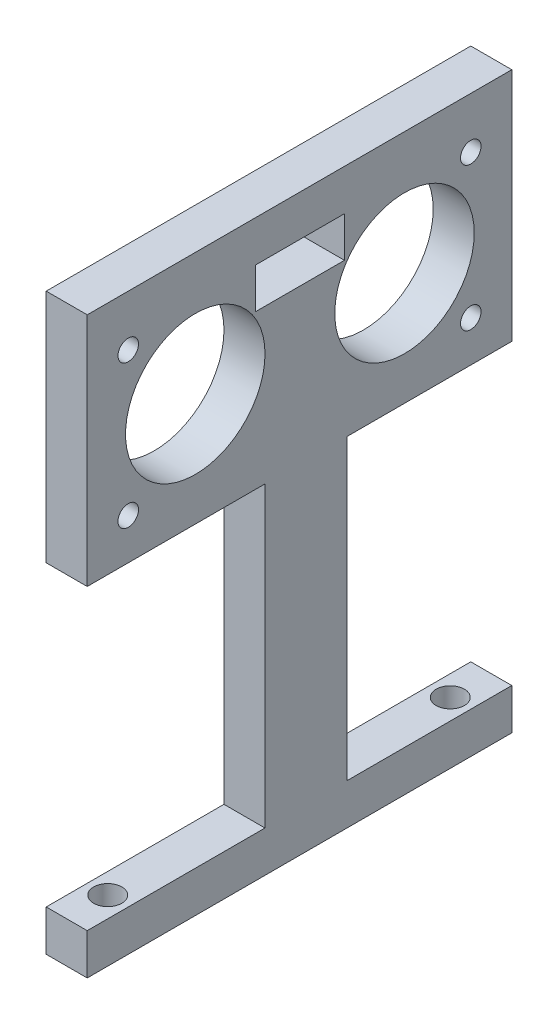
ISO-10303-21;
HEADER;
FILE_DESCRIPTION(('STEP AP214'),'2;1');
FILE_NAME('part.step','',(''),(''),'','','');
FILE_SCHEMA(('AUTOMOTIVE_DESIGN { 1 0 10303 214 1 1 1 1 }'));
ENDSEC;
DATA;
#1=APPLICATION_CONTEXT('core data for automotive mechanical design processes');
#2=APPLICATION_PROTOCOL_DEFINITION('international standard','automotive_design',2000,#1);
#3=PRODUCT_CONTEXT('',#1,'mechanical');
#4=PRODUCT('Part','Part','',(#3));
#5=PRODUCT_RELATED_PRODUCT_CATEGORY('part','',(#4));
#6=PRODUCT_DEFINITION_FORMATION('','',#4);
#7=PRODUCT_DEFINITION_CONTEXT('part definition',#1,'design');
#8=PRODUCT_DEFINITION('design','',#6,#7);
#9=PRODUCT_DEFINITION_SHAPE('','',#8);
#10=(LENGTH_UNIT() NAMED_UNIT(*) SI_UNIT(.MILLI.,.METRE.));
#11=(NAMED_UNIT(*) PLANE_ANGLE_UNIT() SI_UNIT($,.RADIAN.));
#12=(NAMED_UNIT(*) SI_UNIT($,.STERADIAN.) SOLID_ANGLE_UNIT());
#13=UNCERTAINTY_MEASURE_WITH_UNIT(LENGTH_MEASURE(1.E-05),#10,'distance_accuracy_value','');
#14=(GEOMETRIC_REPRESENTATION_CONTEXT(3) GLOBAL_UNCERTAINTY_ASSIGNED_CONTEXT((#13)) GLOBAL_UNIT_ASSIGNED_CONTEXT((#10,
#11,#12)) REPRESENTATION_CONTEXT('',''));
#15=CARTESIAN_POINT('',(0.,0.,0.));
#16=DIRECTION('',(0.,0.,1.));
#17=DIRECTION('',(1.,0.,0.));
#18=AXIS2_PLACEMENT_3D('',#15,#16,#17);
#19=CARTESIAN_POINT('',(5.08,0.,0.));
#20=DIRECTION('',(1.,0.,0.));
#21=DIRECTION('',(0.,0.,-1.));
#22=AXIS2_PLACEMENT_3D('',#19,#20,#21);
#23=PLANE('',#22);
#24=CARTESIAN_POINT('',(5.08,-10.1005701276087,-12.1970297029703));
#25=DIRECTION('',(1.,0.,0.));
#26=DIRECTION('',(0.,0.,-1.));
#27=AXIS2_PLACEMENT_3D('',#24,#25,#26);
#28=CIRCLE('',#27,8.636);
#29=CARTESIAN_POINT('',(5.08,-10.1005701276087,-20.8330297029703));
#30=VERTEX_POINT('',#29);
#31=EDGE_CURVE('E247',#30,#30,#28,.F.);
#32=ORIENTED_EDGE('',*,*,#31,.T.);
#33=EDGE_LOOP('',(#32));
#34=FACE_BOUND('',#33,.T.);
#35=CARTESIAN_POINT('',(5.08,-10.1005701276087,13.7109702970297));
#36=DIRECTION('',(1.,0.,0.));
#37=DIRECTION('',(0.,0.,-1.));
#38=AXIS2_PLACEMENT_3D('',#35,#36,#37);
#39=CIRCLE('',#38,8.636);
#40=CARTESIAN_POINT('',(5.08,-10.1005701276087,5.07497029702969));
#41=VERTEX_POINT('',#40);
#42=EDGE_CURVE('E242',#41,#41,#39,.F.);
#43=ORIENTED_EDGE('',*,*,#42,.T.);
#44=EDGE_LOOP('',(#43));
#45=FACE_BOUND('',#44,.T.);
#46=CARTESIAN_POINT('',(5.08,-1.22390774690241,-20.4042297029423));
#47=DIRECTION('',(1.,0.,0.));
#48=DIRECTION('',(0.,0.,-1.));
#49=AXIS2_PLACEMENT_3D('',#46,#47,#48);
#50=CIRCLE('',#49,1.27);
#51=CARTESIAN_POINT('',(5.08,-1.22390774690241,-21.6742297029423));
#52=VERTEX_POINT('',#51);
#53=EDGE_CURVE('E304',#52,#52,#50,.F.);
#54=ORIENTED_EDGE('',*,*,#53,.T.);
#55=EDGE_LOOP('',(#54));
#56=FACE_BOUND('',#55,.T.);
#57=CARTESIAN_POINT('',(5.08,-18.9772325083057,-20.4042297029423));
#58=DIRECTION('',(1.,0.,0.));
#59=DIRECTION('',(0.,0.,-1.));
#60=AXIS2_PLACEMENT_3D('',#57,#58,#59);
#61=CIRCLE('',#60,1.27);
#62=CARTESIAN_POINT('',(5.08,-18.9772325083057,-21.6742297029423));
#63=VERTEX_POINT('',#62);
#64=EDGE_CURVE('E301',#63,#63,#61,.F.);
#65=ORIENTED_EDGE('',*,*,#64,.T.);
#66=EDGE_LOOP('',(#65));
#67=FACE_BOUND('',#66,.T.);
#68=CARTESIAN_POINT('',(5.08,-18.9772325083057,22.0101702970577));
#69=DIRECTION('',(1.,0.,0.));
#70=DIRECTION('',(0.,0.,-1.));
#71=AXIS2_PLACEMENT_3D('',#68,#69,#70);
#72=CIRCLE('',#71,1.27);
#73=CARTESIAN_POINT('',(5.08,-18.9772325083057,20.7401702970577));
#74=VERTEX_POINT('',#73);
#75=EDGE_CURVE('E298',#74,#74,#72,.F.);
#76=ORIENTED_EDGE('',*,*,#75,.T.);
#77=EDGE_LOOP('',(#76));
#78=FACE_BOUND('',#77,.T.);
#79=CARTESIAN_POINT('',(5.08,-1.22390774690241,22.0101702970577));
#80=DIRECTION('',(1.,0.,0.));
#81=DIRECTION('',(0.,0.,-1.));
#82=AXIS2_PLACEMENT_3D('',#79,#80,#81);
#83=CIRCLE('',#82,1.27);
#84=CARTESIAN_POINT('',(5.08,-1.22390774690241,20.7401702970577));
#85=VERTEX_POINT('',#84);
#86=EDGE_CURVE('E295',#85,#85,#83,.F.);
#87=ORIENTED_EDGE('',*,*,#86,.T.);
#88=EDGE_LOOP('',(#87));
#89=FACE_BOUND('',#88,.T.);
#90=DIRECTION('',(0.,0.,1.));
#91=VECTOR('',#90,1.);
#92=CARTESIAN_POINT('',(5.08,-5.00379999999929,0.));
#93=LINE('',#92,#91);
#94=CARTESIAN_POINT('',(5.08,-5.00379999999929,-4.76538587449008));
#95=VERTEX_POINT('',#94);
#96=CARTESIAN_POINT('',(5.08,-5.00379999999929,6.25821412550992));
#97=VERTEX_POINT('',#96);
#98=EDGE_CURVE('E277',#95,#97,#93,.T.);
#99=ORIENTED_EDGE('',*,*,#98,.T.);
#100=DIRECTION('',(0.,1.,0.));
#101=VECTOR('',#100,1.);
#102=CARTESIAN_POINT('',(5.08,0.,6.25821412550992));
#103=LINE('',#102,#101);
#104=CARTESIAN_POINT('',(5.08,7.11236625150491E-13,6.25821412550992));
#105=VERTEX_POINT('',#104);
#106=EDGE_CURVE('E280',#97,#105,#103,.T.);
#107=ORIENTED_EDGE('',*,*,#106,.T.);
#108=DIRECTION('',(0.,0.,-1.));
#109=VECTOR('',#108,1.);
#110=CARTESIAN_POINT('',(5.08,7.11236625150491E-13,0.));
#111=LINE('',#110,#109);
#112=CARTESIAN_POINT('',(5.08,7.11236625150491E-13,-4.76538587449008));
#113=VERTEX_POINT('',#112);
#114=EDGE_CURVE('E271',#105,#113,#111,.T.);
#115=ORIENTED_EDGE('',*,*,#114,.T.);
#116=DIRECTION('',(0.,-1.,0.));
#117=VECTOR('',#116,1.);
#118=CARTESIAN_POINT('',(5.08,0.,-4.76538587449008));
#119=LINE('',#118,#117);
#120=EDGE_CURVE('E274',#113,#95,#119,.T.);
#121=ORIENTED_EDGE('',*,*,#120,.T.);
#122=EDGE_LOOP('',(#99,#107,#115,#121));
#123=FACE_BOUND('',#122,.T.);
#124=DIRECTION('',(0.,-1.,0.));
#125=VECTOR('',#124,1.);
#126=CARTESIAN_POINT('',(5.08,0.,5.08));
#127=LINE('',#126,#125);
#128=CARTESIAN_POINT('',(5.08,-24.0572325083057,5.08));
#129=VERTEX_POINT('',#128);
#130=CARTESIAN_POINT('',(5.08,-60.96,5.07999999999999));
#131=VERTEX_POINT('',#130);
#132=EDGE_CURVE('E199',#129,#131,#127,.T.);
#133=ORIENTED_EDGE('',*,*,#132,.T.);
#134=DIRECTION('',(0.,0.,1.));
#135=VECTOR('',#134,1.);
#136=CARTESIAN_POINT('',(5.08,-60.96,0.));
#137=LINE('',#136,#135);
#138=CARTESIAN_POINT('',(5.08,-60.96,27.0901702970577));
#139=VERTEX_POINT('',#138);
#140=EDGE_CURVE('E154',#131,#139,#137,.T.);
#141=ORIENTED_EDGE('',*,*,#140,.T.);
#142=DIRECTION('',(0.,1.,0.));
#143=VECTOR('',#142,1.);
#144=CARTESIAN_POINT('',(5.08,0.,27.0901702970577));
#145=LINE('',#144,#143);
#146=CARTESIAN_POINT('',(5.08,-66.04,27.0901702970577));
#147=VERTEX_POINT('',#146);
#148=EDGE_CURVE('E235',#147,#139,#145,.T.);
#149=ORIENTED_EDGE('',*,*,#148,.F.);
#150=DIRECTION('',(0.,0.,-1.));
#151=VECTOR('',#150,1.);
#152=CARTESIAN_POINT('',(5.08,-66.04,27.0901702970577));
#153=LINE('',#152,#151);
#154=CARTESIAN_POINT('',(5.08,-66.04,-25.4842297029423));
#155=VERTEX_POINT('',#154);
#156=EDGE_CURVE('E202',#147,#155,#153,.T.);
#157=ORIENTED_EDGE('',*,*,#156,.T.);
#158=DIRECTION('',(0.,-1.,0.));
#159=VECTOR('',#158,1.);
#160=CARTESIAN_POINT('',(5.08,0.,-25.4842297029423));
#161=LINE('',#160,#159);
#162=CARTESIAN_POINT('',(5.08,-60.96,-25.4842297029423));
#163=VERTEX_POINT('',#162);
#164=EDGE_CURVE('E230',#163,#155,#161,.T.);
#165=ORIENTED_EDGE('',*,*,#164,.F.);
#166=DIRECTION('',(0.,0.,1.));
#167=VECTOR('',#166,1.);
#168=CARTESIAN_POINT('',(5.08,-60.96,0.));
#169=LINE('',#168,#167);
#170=CARTESIAN_POINT('',(5.08,-60.96,-5.07999999999999));
#171=VERTEX_POINT('',#170);
#172=EDGE_CURVE('E57',#163,#171,#169,.T.);
#173=ORIENTED_EDGE('',*,*,#172,.T.);
#174=DIRECTION('',(0.,1.,0.));
#175=VECTOR('',#174,1.);
#176=CARTESIAN_POINT('',(5.08,0.,-5.08));
#177=LINE('',#176,#175);
#178=CARTESIAN_POINT('',(5.08,-24.0572325083057,-5.08));
#179=VERTEX_POINT('',#178);
#180=EDGE_CURVE('E196',#171,#179,#177,.T.);
#181=ORIENTED_EDGE('',*,*,#180,.T.);
#182=DIRECTION('',(0.,0.,-1.));
#183=VECTOR('',#182,1.);
#184=CARTESIAN_POINT('',(5.08,-24.0572325083057,0.));
#185=LINE('',#184,#183);
#186=CARTESIAN_POINT('',(5.08,-24.0572325083057,-25.4842297029423));
#187=VERTEX_POINT('',#186);
#188=EDGE_CURVE('E191',#179,#187,#185,.T.);
#189=ORIENTED_EDGE('',*,*,#188,.T.);
#190=CARTESIAN_POINT('',(5.08,5.08,-25.4842297029423));
#191=VERTEX_POINT('',#190);
#192=EDGE_CURVE('E231',#191,#187,#161,.T.);
#193=ORIENTED_EDGE('',*,*,#192,.F.);
#194=DIRECTION('',(0.,0.,-1.));
#195=VECTOR('',#194,1.);
#196=CARTESIAN_POINT('',(5.08,5.08,0.));
#197=LINE('',#196,#195);
#198=CARTESIAN_POINT('',(5.08,5.08,27.0901702970577));
#199=VERTEX_POINT('',#198);
#200=EDGE_CURVE('E228',#199,#191,#197,.T.);
#201=ORIENTED_EDGE('',*,*,#200,.F.);
#202=CARTESIAN_POINT('',(5.08,-24.0572325083057,27.0901702970577));
#203=VERTEX_POINT('',#202);
#204=EDGE_CURVE('E234',#203,#199,#145,.T.);
#205=ORIENTED_EDGE('',*,*,#204,.F.);
#206=DIRECTION('',(0.,0.,-1.));
#207=VECTOR('',#206,1.);
#208=CARTESIAN_POINT('',(5.08,-24.0572325083057,0.));
#209=LINE('',#208,#207);
#210=EDGE_CURVE('E49',#203,#129,#209,.T.);
#211=ORIENTED_EDGE('',*,*,#210,.T.);
#212=EDGE_LOOP('',(#133,#141,#149,#157,#165,#173,#181,#189,#193,#201,#205,#211));
#213=FACE_BOUND('',#212,.T.);
#214=ADVANCED_FACE('F32',(#34,#45,#56,#67,#78,#89,#123,#213),#23,.T.);
#215=CARTESIAN_POINT('',(0.,0.,0.));
#216=DIRECTION('',(1.,0.,0.));
#217=DIRECTION('',(0.,0.,-1.));
#218=AXIS2_PLACEMENT_3D('',#215,#216,#217);
#219=PLANE('',#218);
#220=DIRECTION('',(0.,-1.,0.));
#221=VECTOR('',#220,1.);
#222=CARTESIAN_POINT('',(0.,7.11236625150491E-13,6.25821412550992));
#223=LINE('',#222,#221);
#224=CARTESIAN_POINT('',(0.,7.11236625150491E-13,6.25821412550992));
#225=VERTEX_POINT('',#224);
#226=CARTESIAN_POINT('',(0.,-5.00379999999929,6.25821412550992));
#227=VERTEX_POINT('',#226);
#228=EDGE_CURVE('E250',#225,#227,#223,.T.);
#229=ORIENTED_EDGE('',*,*,#228,.T.);
#230=DIRECTION('',(0.,0.,-1.));
#231=VECTOR('',#230,1.);
#232=CARTESIAN_POINT('',(0.,-5.00379999999929,6.25821412550992));
#233=LINE('',#232,#231);
#234=CARTESIAN_POINT('',(0.,-5.00379999999929,-4.76538587449008));
#235=VERTEX_POINT('',#234);
#236=EDGE_CURVE('E253',#227,#235,#233,.T.);
#237=ORIENTED_EDGE('',*,*,#236,.T.);
#238=DIRECTION('',(0.,1.,0.));
#239=VECTOR('',#238,1.);
#240=CARTESIAN_POINT('',(0.,7.11236625150491E-13,-4.76538587449008));
#241=LINE('',#240,#239);
#242=CARTESIAN_POINT('',(0.,7.11236625150491E-13,-4.76538587449008));
#243=VERTEX_POINT('',#242);
#244=EDGE_CURVE('E256',#235,#243,#241,.T.);
#245=ORIENTED_EDGE('',*,*,#244,.T.);
#246=DIRECTION('',(0.,0.,1.));
#247=VECTOR('',#246,1.);
#248=CARTESIAN_POINT('',(0.,7.11236625150491E-13,6.25821412550992));
#249=LINE('',#248,#247);
#250=EDGE_CURVE('E259',#243,#225,#249,.T.);
#251=ORIENTED_EDGE('',*,*,#250,.T.);
#252=EDGE_LOOP('',(#229,#237,#245,#251));
#253=FACE_BOUND('',#252,.T.);
#254=CARTESIAN_POINT('',(0.,-1.22390774690241,-20.4042297029423));
#255=DIRECTION('',(1.,0.,0.));
#256=DIRECTION('',(0.,0.,1.));
#257=AXIS2_PLACEMENT_3D('',#254,#255,#256);
#258=CIRCLE('',#257,1.27);
#259=CARTESIAN_POINT('',(0.,-1.22390774690241,-19.1342297029423));
#260=VERTEX_POINT('',#259);
#261=EDGE_CURVE('E283',#260,#260,#258,.T.);
#262=ORIENTED_EDGE('',*,*,#261,.T.);
#263=EDGE_LOOP('',(#262));
#264=FACE_BOUND('',#263,.T.);
#265=CARTESIAN_POINT('',(0.,-18.9772325083057,-20.4042297029423));
#266=DIRECTION('',(1.,0.,0.));
#267=DIRECTION('',(0.,0.,-1.));
#268=AXIS2_PLACEMENT_3D('',#265,#266,#267);
#269=CIRCLE('',#268,1.27);
#270=CARTESIAN_POINT('',(0.,-18.9772325083057,-21.6742297029423));
#271=VERTEX_POINT('',#270);
#272=EDGE_CURVE('E288',#271,#271,#269,.T.);
#273=ORIENTED_EDGE('',*,*,#272,.T.);
#274=EDGE_LOOP('',(#273));
#275=FACE_BOUND('',#274,.T.);
#276=CARTESIAN_POINT('',(0.,-18.9772325083057,22.0101702970577));
#277=DIRECTION('',(1.,0.,0.));
#278=DIRECTION('',(0.,0.,1.));
#279=AXIS2_PLACEMENT_3D('',#276,#277,#278);
#280=CIRCLE('',#279,1.27);
#281=CARTESIAN_POINT('',(0.,-18.9772325083057,23.2801702970577));
#282=VERTEX_POINT('',#281);
#283=EDGE_CURVE('E284',#282,#282,#280,.T.);
#284=ORIENTED_EDGE('',*,*,#283,.T.);
#285=EDGE_LOOP('',(#284));
#286=FACE_BOUND('',#285,.T.);
#287=CARTESIAN_POINT('',(0.,-1.22390774690241,22.0101702970577));
#288=DIRECTION('',(1.,0.,0.));
#289=DIRECTION('',(0.,0.,-1.));
#290=AXIS2_PLACEMENT_3D('',#287,#288,#289);
#291=CIRCLE('',#290,1.27);
#292=CARTESIAN_POINT('',(0.,-1.22390774690241,20.7401702970577));
#293=VERTEX_POINT('',#292);
#294=EDGE_CURVE('E287',#293,#293,#291,.T.);
#295=ORIENTED_EDGE('',*,*,#294,.T.);
#296=EDGE_LOOP('',(#295));
#297=FACE_BOUND('',#296,.T.);
#298=CARTESIAN_POINT('',(0.,-10.1005701276087,13.7109702970297));
#299=DIRECTION('',(1.,0.,0.));
#300=DIRECTION('',(0.,0.,-1.));
#301=AXIS2_PLACEMENT_3D('',#298,#299,#300);
#302=CIRCLE('',#301,8.636);
#303=CARTESIAN_POINT('',(0.,-10.1005701276087,5.07497029702969));
#304=VERTEX_POINT('',#303);
#305=EDGE_CURVE('E238',#304,#304,#302,.T.);
#306=ORIENTED_EDGE('',*,*,#305,.T.);
#307=EDGE_LOOP('',(#306));
#308=FACE_BOUND('',#307,.T.);
#309=CARTESIAN_POINT('',(0.,-10.1005701276087,-12.1970297029703));
#310=DIRECTION('',(1.,0.,0.));
#311=DIRECTION('',(0.,0.,-1.));
#312=AXIS2_PLACEMENT_3D('',#309,#310,#311);
#313=CIRCLE('',#312,8.636);
#314=CARTESIAN_POINT('',(0.,-10.1005701276087,-20.8330297029703));
#315=VERTEX_POINT('',#314);
#316=EDGE_CURVE('E239',#315,#315,#313,.T.);
#317=ORIENTED_EDGE('',*,*,#316,.T.);
#318=EDGE_LOOP('',(#317));
#319=FACE_BOUND('',#318,.T.);
#320=DIRECTION('',(0.,0.,-1.));
#321=VECTOR('',#320,1.);
#322=CARTESIAN_POINT('',(0.,-60.96,30.6593827177156));
#323=LINE('',#322,#321);
#324=CARTESIAN_POINT('',(0.,-60.96,27.0901702970577));
#325=VERTEX_POINT('',#324);
#326=CARTESIAN_POINT('',(0.,-60.96,5.07999999999999));
#327=VERTEX_POINT('',#326);
#328=EDGE_CURVE('E151',#325,#327,#323,.T.);
#329=ORIENTED_EDGE('',*,*,#328,.T.);
#330=DIRECTION('',(0.,1.,0.));
#331=VECTOR('',#330,1.);
#332=CARTESIAN_POINT('',(0.,-24.0572325083057,5.08));
#333=LINE('',#332,#331);
#334=CARTESIAN_POINT('',(0.,-24.0572325083057,5.08));
#335=VERTEX_POINT('',#334);
#336=EDGE_CURVE('E160',#327,#335,#333,.T.);
#337=ORIENTED_EDGE('',*,*,#336,.T.);
#338=DIRECTION('',(0.,0.,1.));
#339=VECTOR('',#338,1.);
#340=CARTESIAN_POINT('',(0.,-24.0572325083057,30.6593827177156));
#341=LINE('',#340,#339);
#342=CARTESIAN_POINT('',(0.,-24.0572325083057,27.0901702970577));
#343=VERTEX_POINT('',#342);
#344=EDGE_CURVE('E165',#335,#343,#341,.T.);
#345=ORIENTED_EDGE('',*,*,#344,.T.);
#346=DIRECTION('',(0.,-1.,0.));
#347=VECTOR('',#346,1.);
#348=CARTESIAN_POINT('',(0.,5.08,27.0901702970577));
#349=LINE('',#348,#347);
#350=CARTESIAN_POINT('',(0.,5.08,27.0901702970577));
#351=VERTEX_POINT('',#350);
#352=EDGE_CURVE('E213',#351,#343,#349,.T.);
#353=ORIENTED_EDGE('',*,*,#352,.F.);
#354=DIRECTION('',(0.,0.,1.));
#355=VECTOR('',#354,1.);
#356=CARTESIAN_POINT('',(0.,5.08,27.0901702970577));
#357=LINE('',#356,#355);
#358=CARTESIAN_POINT('',(0.,5.08,-25.4842297029423));
#359=VERTEX_POINT('',#358);
#360=EDGE_CURVE('E220',#359,#351,#357,.T.);
#361=ORIENTED_EDGE('',*,*,#360,.F.);
#362=DIRECTION('',(0.,1.,0.));
#363=VECTOR('',#362,1.);
#364=CARTESIAN_POINT('',(0.,5.08,-25.4842297029423));
#365=LINE('',#364,#363);
#366=CARTESIAN_POINT('',(0.,-24.0572325083057,-25.4842297029423));
#367=VERTEX_POINT('',#366);
#368=EDGE_CURVE('E216',#367,#359,#365,.T.);
#369=ORIENTED_EDGE('',*,*,#368,.F.);
#370=DIRECTION('',(0.,0.,1.));
#371=VECTOR('',#370,1.);
#372=CARTESIAN_POINT('',(0.,-24.0572325083057,-30.6593827177156));
#373=LINE('',#372,#371);
#374=CARTESIAN_POINT('',(0.,-24.0572325083057,-5.08));
#375=VERTEX_POINT('',#374);
#376=EDGE_CURVE('E180',#367,#375,#373,.T.);
#377=ORIENTED_EDGE('',*,*,#376,.T.);
#378=DIRECTION('',(0.,-1.,0.));
#379=VECTOR('',#378,1.);
#380=CARTESIAN_POINT('',(0.,-24.0572325083057,-5.08));
#381=LINE('',#380,#379);
#382=CARTESIAN_POINT('',(0.,-60.96,-5.07999999999999));
#383=VERTEX_POINT('',#382);
#384=EDGE_CURVE('E183',#375,#383,#381,.T.);
#385=ORIENTED_EDGE('',*,*,#384,.T.);
#386=DIRECTION('',(0.,0.,-1.));
#387=VECTOR('',#386,1.);
#388=CARTESIAN_POINT('',(0.,-60.96,-30.6593827177156));
#389=LINE('',#388,#387);
#390=CARTESIAN_POINT('',(0.,-60.96,-25.4842297029423));
#391=VERTEX_POINT('',#390);
#392=EDGE_CURVE('E186',#383,#391,#389,.T.);
#393=ORIENTED_EDGE('',*,*,#392,.T.);
#394=CARTESIAN_POINT('',(0.,-66.04,-25.4842297029423));
#395=VERTEX_POINT('',#394);
#396=EDGE_CURVE('E217',#395,#391,#365,.T.);
#397=ORIENTED_EDGE('',*,*,#396,.F.);
#398=DIRECTION('',(0.,0.,-1.));
#399=VECTOR('',#398,1.);
#400=CARTESIAN_POINT('',(0.,-66.04,27.0901702970577));
#401=LINE('',#400,#399);
#402=CARTESIAN_POINT('',(0.,-66.04,27.0901702970577));
#403=VERTEX_POINT('',#402);
#404=EDGE_CURVE('E201',#403,#395,#401,.T.);
#405=ORIENTED_EDGE('',*,*,#404,.F.);
#406=EDGE_CURVE('E169',#325,#403,#349,.T.);
#407=ORIENTED_EDGE('',*,*,#406,.F.);
#408=EDGE_LOOP('',(#329,#337,#345,#353,#361,#369,#377,#385,#393,#397,#405,#407));
#409=FACE_BOUND('',#408,.T.);
#410=ADVANCED_FACE('F34',(#253,#264,#275,#286,#297,#308,#319,#409),#219,.F.);
#411=CARTESIAN_POINT('',(25.908,5.08,27.0901702970577));
#412=DIRECTION('',(0.,0.,-1.));
#413=DIRECTION('',(0.,1.,0.));
#414=AXIS2_PLACEMENT_3D('',#411,#412,#413);
#415=PLANE('',#414);
#416=DIRECTION('',(1.,0.,0.));
#417=VECTOR('',#416,1.);
#418=CARTESIAN_POINT('',(25.908,-60.96,27.0901702970577));
#419=LINE('',#418,#417);
#420=EDGE_CURVE('E11',#325,#139,#419,.T.);
#421=ORIENTED_EDGE('',*,*,#420,.F.);
#422=ORIENTED_EDGE('',*,*,#406,.T.);
#423=DIRECTION('',(-1.,0.,0.));
#424=VECTOR('',#423,1.);
#425=CARTESIAN_POINT('',(5.08,-66.04,27.0901702970577));
#426=LINE('',#425,#424);
#427=EDGE_CURVE('E205',#147,#403,#426,.T.);
#428=ORIENTED_EDGE('',*,*,#427,.F.);
#429=ORIENTED_EDGE('',*,*,#148,.T.);
#430=EDGE_LOOP('',(#421,#422,#428,#429));
#431=FACE_BOUND('',#430,.T.);
#432=ADVANCED_FACE('F344',(#431),#415,.F.);
#433=DIRECTION('',(-1.,0.,0.));
#434=VECTOR('',#433,1.);
#435=CARTESIAN_POINT('',(25.908,-24.0572325083057,27.0901702970577));
#436=LINE('',#435,#434);
#437=EDGE_CURVE('E41',#203,#343,#436,.T.);
#438=ORIENTED_EDGE('',*,*,#437,.F.);
#439=ORIENTED_EDGE('',*,*,#204,.T.);
#440=DIRECTION('',(-1.,0.,0.));
#441=VECTOR('',#440,1.);
#442=CARTESIAN_POINT('',(25.908,5.08,27.0901702970577));
#443=LINE('',#442,#441);
#444=EDGE_CURVE('E223',#199,#351,#443,.T.);
#445=ORIENTED_EDGE('',*,*,#444,.T.);
#446=ORIENTED_EDGE('',*,*,#352,.T.);
#447=EDGE_LOOP('',(#438,#439,#445,#446));
#448=FACE_BOUND('',#447,.T.);
#449=ADVANCED_FACE('F392',(#448),#415,.F.);
#450=CARTESIAN_POINT('',(25.908,5.08,-25.4842297029423));
#451=DIRECTION('',(0.,0.,1.));
#452=DIRECTION('',(0.,-1.,0.));
#453=AXIS2_PLACEMENT_3D('',#450,#451,#452);
#454=PLANE('',#453);
#455=DIRECTION('',(1.,0.,0.));
#456=VECTOR('',#455,1.);
#457=CARTESIAN_POINT('',(25.908,-24.0572325083057,-25.4842297029423));
#458=LINE('',#457,#456);
#459=EDGE_CURVE('E309',#367,#187,#458,.T.);
#460=ORIENTED_EDGE('',*,*,#459,.F.);
#461=ORIENTED_EDGE('',*,*,#368,.T.);
#462=DIRECTION('',(-1.,0.,0.));
#463=VECTOR('',#462,1.);
#464=CARTESIAN_POINT('',(25.908,5.08,-25.4842297029423));
#465=LINE('',#464,#463);
#466=EDGE_CURVE('E225',#191,#359,#465,.T.);
#467=ORIENTED_EDGE('',*,*,#466,.F.);
#468=ORIENTED_EDGE('',*,*,#192,.T.);
#469=EDGE_LOOP('',(#460,#461,#467,#468));
#470=FACE_BOUND('',#469,.T.);
#471=ADVANCED_FACE('F394',(#470),#454,.F.);
#472=DIRECTION('',(-1.,0.,0.));
#473=VECTOR('',#472,1.);
#474=CARTESIAN_POINT('',(25.908,-60.96,-25.4842297029423));
#475=LINE('',#474,#473);
#476=EDGE_CURVE('E307',#163,#391,#475,.T.);
#477=ORIENTED_EDGE('',*,*,#476,.F.);
#478=ORIENTED_EDGE('',*,*,#164,.T.);
#479=DIRECTION('',(-1.,0.,0.));
#480=VECTOR('',#479,1.);
#481=CARTESIAN_POINT('',(5.08,-66.04,-25.4842297029423));
#482=LINE('',#481,#480);
#483=EDGE_CURVE('E210',#155,#395,#482,.T.);
#484=ORIENTED_EDGE('',*,*,#483,.T.);
#485=ORIENTED_EDGE('',*,*,#396,.T.);
#486=EDGE_LOOP('',(#477,#478,#484,#485));
#487=FACE_BOUND('',#486,.T.);
#488=ADVANCED_FACE('F352',(#487),#454,.F.);
#489=CARTESIAN_POINT('',(25.908,-1.22390774690241,22.0101702970577));
#490=DIRECTION('',(-1.,0.,0.));
#491=DIRECTION('',(0.,0.,1.));
#492=AXIS2_PLACEMENT_3D('',#489,#490,#491);
#493=CYLINDRICAL_SURFACE('',#492,1.27);
#494=ORIENTED_EDGE('',*,*,#86,.F.);
#495=EDGE_LOOP('',(#494));
#496=FACE_BOUND('',#495,.T.);
#497=ORIENTED_EDGE('',*,*,#294,.F.);
#498=EDGE_LOOP('',(#497));
#499=FACE_BOUND('',#498,.T.);
#500=ADVANCED_FACE('F348',(#496,#499),#493,.F.);
#501=CARTESIAN_POINT('',(25.908,-18.9772325083057,22.0101702970577));
#502=DIRECTION('',(-1.,0.,0.));
#503=DIRECTION('',(0.,0.,1.));
#504=AXIS2_PLACEMENT_3D('',#501,#502,#503);
#505=CYLINDRICAL_SURFACE('',#504,1.27);
#506=ORIENTED_EDGE('',*,*,#75,.F.);
#507=EDGE_LOOP('',(#506));
#508=FACE_BOUND('',#507,.T.);
#509=ORIENTED_EDGE('',*,*,#283,.F.);
#510=EDGE_LOOP('',(#509));
#511=FACE_BOUND('',#510,.T.);
#512=ADVANCED_FACE('F351',(#508,#511),#505,.F.);
#513=CARTESIAN_POINT('',(25.908,-18.9772325083057,-20.4042297029423));
#514=DIRECTION('',(-1.,0.,0.));
#515=DIRECTION('',(0.,0.,1.));
#516=AXIS2_PLACEMENT_3D('',#513,#514,#515);
#517=CYLINDRICAL_SURFACE('',#516,1.27);
#518=ORIENTED_EDGE('',*,*,#64,.F.);
#519=EDGE_LOOP('',(#518));
#520=FACE_BOUND('',#519,.T.);
#521=ORIENTED_EDGE('',*,*,#272,.F.);
#522=EDGE_LOOP('',(#521));
#523=FACE_BOUND('',#522,.T.);
#524=ADVANCED_FACE('F358',(#520,#523),#517,.F.);
#525=CARTESIAN_POINT('',(25.908,-1.22390774690241,-20.4042297029423));
#526=DIRECTION('',(-1.,0.,0.));
#527=DIRECTION('',(0.,0.,1.));
#528=AXIS2_PLACEMENT_3D('',#525,#526,#527);
#529=CYLINDRICAL_SURFACE('',#528,1.27);
#530=ORIENTED_EDGE('',*,*,#53,.F.);
#531=EDGE_LOOP('',(#530));
#532=FACE_BOUND('',#531,.T.);
#533=ORIENTED_EDGE('',*,*,#261,.F.);
#534=EDGE_LOOP('',(#533));
#535=FACE_BOUND('',#534,.T.);
#536=ADVANCED_FACE('F354',(#532,#535),#529,.F.);
#537=CARTESIAN_POINT('',(25.908,7.11236625150491E-13,6.25821412550992));
#538=DIRECTION('',(0.,0.,-1.));
#539=DIRECTION('',(0.,1.,0.));
#540=AXIS2_PLACEMENT_3D('',#537,#538,#539);
#541=PLANE('',#540);
#542=DIRECTION('',(-1.,0.,0.));
#543=VECTOR('',#542,1.);
#544=CARTESIAN_POINT('',(25.908,-5.00379999999929,6.25821412550992));
#545=LINE('',#544,#543);
#546=EDGE_CURVE('E269',#97,#227,#545,.T.);
#547=ORIENTED_EDGE('',*,*,#546,.T.);
#548=ORIENTED_EDGE('',*,*,#228,.F.);
#549=DIRECTION('',(-1.,0.,0.));
#550=VECTOR('',#549,1.);
#551=CARTESIAN_POINT('',(25.908,7.11236625150491E-13,6.25821412550992));
#552=LINE('',#551,#550);
#553=EDGE_CURVE('E262',#105,#225,#552,.T.);
#554=ORIENTED_EDGE('',*,*,#553,.F.);
#555=ORIENTED_EDGE('',*,*,#106,.F.);
#556=EDGE_LOOP('',(#547,#548,#554,#555));
#557=FACE_BOUND('',#556,.T.);
#558=ADVANCED_FACE('F357',(#557),#541,.T.);
#559=CARTESIAN_POINT('',(25.908,-5.00379999999929,6.25821412550992));
#560=DIRECTION('',(0.,1.,0.));
#561=DIRECTION('',(0.,0.,1.));
#562=AXIS2_PLACEMENT_3D('',#559,#560,#561);
#563=PLANE('',#562);
#564=DIRECTION('',(-1.,0.,0.));
#565=VECTOR('',#564,1.);
#566=CARTESIAN_POINT('',(25.908,-5.00379999999929,-4.76538587449008));
#567=LINE('',#566,#565);
#568=EDGE_CURVE('E267',#95,#235,#567,.T.);
#569=ORIENTED_EDGE('',*,*,#568,.T.);
#570=ORIENTED_EDGE('',*,*,#236,.F.);
#571=ORIENTED_EDGE('',*,*,#546,.F.);
#572=ORIENTED_EDGE('',*,*,#98,.F.);
#573=EDGE_LOOP('',(#569,#570,#571,#572));
#574=FACE_BOUND('',#573,.T.);
#575=ADVANCED_FACE('F368',(#574),#563,.T.);
#576=CARTESIAN_POINT('',(25.908,7.11236625150491E-13,-4.76538587449008));
#577=DIRECTION('',(0.,0.,1.));
#578=DIRECTION('',(0.,-1.,0.));
#579=AXIS2_PLACEMENT_3D('',#576,#577,#578);
#580=PLANE('',#579);
#581=DIRECTION('',(-1.,0.,0.));
#582=VECTOR('',#581,1.);
#583=CARTESIAN_POINT('',(25.908,7.11236625150491E-13,-4.76538587449008));
#584=LINE('',#583,#582);
#585=EDGE_CURVE('E265',#113,#243,#584,.T.);
#586=ORIENTED_EDGE('',*,*,#585,.T.);
#587=ORIENTED_EDGE('',*,*,#244,.F.);
#588=ORIENTED_EDGE('',*,*,#568,.F.);
#589=ORIENTED_EDGE('',*,*,#120,.F.);
#590=EDGE_LOOP('',(#586,#587,#588,#589));
#591=FACE_BOUND('',#590,.T.);
#592=ADVANCED_FACE('F372',(#591),#580,.T.);
#593=CARTESIAN_POINT('',(25.908,7.11236625150491E-13,6.25821412550992));
#594=DIRECTION('',(0.,-1.,0.));
#595=DIRECTION('',(0.,0.,-1.));
#596=AXIS2_PLACEMENT_3D('',#593,#594,#595);
#597=PLANE('',#596);
#598=ORIENTED_EDGE('',*,*,#553,.T.);
#599=ORIENTED_EDGE('',*,*,#250,.F.);
#600=ORIENTED_EDGE('',*,*,#585,.F.);
#601=ORIENTED_EDGE('',*,*,#114,.F.);
#602=EDGE_LOOP('',(#598,#599,#600,#601));
#603=FACE_BOUND('',#602,.T.);
#604=ADVANCED_FACE('F376',(#603),#597,.T.);
#605=CARTESIAN_POINT('',(25.908,-10.1005701276087,13.7109702970297));
#606=DIRECTION('',(-1.,0.,0.));
#607=DIRECTION('',(0.,0.,1.));
#608=AXIS2_PLACEMENT_3D('',#605,#606,#607);
#609=CYLINDRICAL_SURFACE('',#608,8.636);
#610=ORIENTED_EDGE('',*,*,#42,.F.);
#611=EDGE_LOOP('',(#610));
#612=FACE_BOUND('',#611,.T.);
#613=ORIENTED_EDGE('',*,*,#305,.F.);
#614=EDGE_LOOP('',(#613));
#615=FACE_BOUND('',#614,.T.);
#616=ADVANCED_FACE('F380',(#612,#615),#609,.F.);
#617=CARTESIAN_POINT('',(25.908,-10.1005701276087,-12.1970297029703));
#618=DIRECTION('',(-1.,0.,0.));
#619=DIRECTION('',(0.,0.,1.));
#620=AXIS2_PLACEMENT_3D('',#617,#618,#619);
#621=CYLINDRICAL_SURFACE('',#620,8.636);
#622=ORIENTED_EDGE('',*,*,#31,.F.);
#623=EDGE_LOOP('',(#622));
#624=FACE_BOUND('',#623,.T.);
#625=ORIENTED_EDGE('',*,*,#316,.F.);
#626=EDGE_LOOP('',(#625));
#627=FACE_BOUND('',#626,.T.);
#628=ADVANCED_FACE('F384',(#624,#627),#621,.F.);
#629=CARTESIAN_POINT('',(25.908,5.08,27.0901702970577));
#630=DIRECTION('',(0.,-1.,0.));
#631=DIRECTION('',(0.,0.,-1.));
#632=AXIS2_PLACEMENT_3D('',#629,#630,#631);
#633=PLANE('',#632);
#634=ORIENTED_EDGE('',*,*,#200,.T.);
#635=ORIENTED_EDGE('',*,*,#466,.T.);
#636=ORIENTED_EDGE('',*,*,#360,.T.);
#637=ORIENTED_EDGE('',*,*,#444,.F.);
#638=EDGE_LOOP('',(#634,#635,#636,#637));
#639=FACE_BOUND('',#638,.T.);
#640=ADVANCED_FACE('F388',(#639),#633,.F.);
#641=CARTESIAN_POINT('',(5.08,-66.04,27.0901702970577));
#642=DIRECTION('',(0.,1.,0.));
#643=DIRECTION('',(0.,0.,1.));
#644=AXIS2_PLACEMENT_3D('',#641,#642,#643);
#645=PLANE('',#644);
#646=CARTESIAN_POINT('',(2.54,-66.04,22.0101702970577));
#647=DIRECTION('',(0.,1.,0.));
#648=DIRECTION('',(0.,0.,1.));
#649=AXIS2_PLACEMENT_3D('',#646,#647,#648);
#650=CIRCLE('',#649,1.7526);
#651=CARTESIAN_POINT('',(2.54,-66.04,23.7627702970577));
#652=VERTEX_POINT('',#651);
#653=EDGE_CURVE('E313',#652,#652,#650,.T.);
#654=ORIENTED_EDGE('',*,*,#653,.T.);
#655=EDGE_LOOP('',(#654));
#656=FACE_BOUND('',#655,.T.);
#657=CARTESIAN_POINT('',(2.54,-66.04,-20.4042297029423));
#658=DIRECTION('',(0.,1.,0.));
#659=DIRECTION('',(0.,0.,-1.));
#660=AXIS2_PLACEMENT_3D('',#657,#658,#659);
#661=CIRCLE('',#660,1.7526);
#662=CARTESIAN_POINT('',(2.54,-66.04,-22.1568297029423));
#663=VERTEX_POINT('',#662);
#664=EDGE_CURVE('E175',#663,#663,#661,.T.);
#665=ORIENTED_EDGE('',*,*,#664,.T.);
#666=EDGE_LOOP('',(#665));
#667=FACE_BOUND('',#666,.T.);
#668=ORIENTED_EDGE('',*,*,#404,.T.);
#669=ORIENTED_EDGE('',*,*,#483,.F.);
#670=ORIENTED_EDGE('',*,*,#156,.F.);
#671=ORIENTED_EDGE('',*,*,#427,.T.);
#672=EDGE_LOOP('',(#668,#669,#670,#671));
#673=FACE_BOUND('',#672,.T.);
#674=ADVANCED_FACE('F323',(#656,#667,#673),#645,.F.);
#675=CARTESIAN_POINT('',(10.16,-24.0572325083057,-30.6593827177156));
#676=DIRECTION('',(0.,-1.,0.));
#677=DIRECTION('',(0.,0.,-1.));
#678=AXIS2_PLACEMENT_3D('',#675,#676,#677);
#679=PLANE('',#678);
#680=DIRECTION('',(-1.,0.,0.));
#681=VECTOR('',#680,1.);
#682=CARTESIAN_POINT('',(10.16,-24.0572325083057,-5.08));
#683=LINE('',#682,#681);
#684=EDGE_CURVE('E170',#179,#375,#683,.T.);
#685=ORIENTED_EDGE('',*,*,#684,.T.);
#686=ORIENTED_EDGE('',*,*,#376,.F.);
#687=ORIENTED_EDGE('',*,*,#459,.T.);
#688=ORIENTED_EDGE('',*,*,#188,.F.);
#689=EDGE_LOOP('',(#685,#686,#687,#688));
#690=FACE_BOUND('',#689,.T.);
#691=ADVANCED_FACE('F403',(#690),#679,.T.);
#692=CARTESIAN_POINT('',(10.16,-24.0572325083057,-5.08));
#693=DIRECTION('',(0.,0.,-1.));
#694=DIRECTION('',(0.,1.,0.));
#695=AXIS2_PLACEMENT_3D('',#692,#693,#694);
#696=PLANE('',#695);
#697=DIRECTION('',(-1.,0.,0.));
#698=VECTOR('',#697,1.);
#699=CARTESIAN_POINT('',(10.16,-60.96,-5.07999999999999));
#700=LINE('',#699,#698);
#701=EDGE_CURVE('E172',#171,#383,#700,.T.);
#702=ORIENTED_EDGE('',*,*,#701,.T.);
#703=ORIENTED_EDGE('',*,*,#384,.F.);
#704=ORIENTED_EDGE('',*,*,#684,.F.);
#705=ORIENTED_EDGE('',*,*,#180,.F.);
#706=EDGE_LOOP('',(#702,#703,#704,#705));
#707=FACE_BOUND('',#706,.T.);
#708=ADVANCED_FACE('F406',(#707),#696,.T.);
#709=CARTESIAN_POINT('',(10.16,-60.96,-30.6593827177156));
#710=DIRECTION('',(0.,1.,0.));
#711=DIRECTION('',(0.,0.,1.));
#712=AXIS2_PLACEMENT_3D('',#709,#710,#711);
#713=PLANE('',#712);
#714=CARTESIAN_POINT('',(2.54,-60.96,-20.4042297029423));
#715=DIRECTION('',(0.,1.,0.));
#716=DIRECTION('',(0.,0.,1.));
#717=AXIS2_PLACEMENT_3D('',#714,#715,#716);
#718=CIRCLE('',#717,1.7526);
#719=CARTESIAN_POINT('',(2.54,-60.96,-18.6516297029423));
#720=VERTEX_POINT('',#719);
#721=EDGE_CURVE('E36',#720,#720,#718,.F.);
#722=ORIENTED_EDGE('',*,*,#721,.T.);
#723=EDGE_LOOP('',(#722));
#724=FACE_BOUND('',#723,.T.);
#725=ORIENTED_EDGE('',*,*,#476,.T.);
#726=ORIENTED_EDGE('',*,*,#392,.F.);
#727=ORIENTED_EDGE('',*,*,#701,.F.);
#728=ORIENTED_EDGE('',*,*,#172,.F.);
#729=EDGE_LOOP('',(#725,#726,#727,#728));
#730=FACE_BOUND('',#729,.T.);
#731=ADVANCED_FACE('F410',(#724,#730),#713,.T.);
#732=CARTESIAN_POINT('',(10.16,-60.96,30.6593827177156));
#733=DIRECTION('',(0.,1.,0.));
#734=DIRECTION('',(0.,0.,1.));
#735=AXIS2_PLACEMENT_3D('',#732,#733,#734);
#736=PLANE('',#735);
#737=CARTESIAN_POINT('',(2.54,-60.96,22.0101702970577));
#738=DIRECTION('',(0.,1.,0.));
#739=DIRECTION('',(0.,0.,1.));
#740=AXIS2_PLACEMENT_3D('',#737,#738,#739);
#741=CIRCLE('',#740,1.7526);
#742=CARTESIAN_POINT('',(2.54,-60.96,23.7627702970577));
#743=VERTEX_POINT('',#742);
#744=EDGE_CURVE('E311',#743,#743,#741,.F.);
#745=ORIENTED_EDGE('',*,*,#744,.T.);
#746=EDGE_LOOP('',(#745));
#747=FACE_BOUND('',#746,.T.);
#748=DIRECTION('',(-1.,0.,0.));
#749=VECTOR('',#748,1.);
#750=CARTESIAN_POINT('',(10.16,-60.96,5.07999999999999));
#751=LINE('',#750,#749);
#752=EDGE_CURVE('E147',#131,#327,#751,.T.);
#753=ORIENTED_EDGE('',*,*,#752,.T.);
#754=ORIENTED_EDGE('',*,*,#328,.F.);
#755=ORIENTED_EDGE('',*,*,#420,.T.);
#756=ORIENTED_EDGE('',*,*,#140,.F.);
#757=EDGE_LOOP('',(#753,#754,#755,#756));
#758=FACE_BOUND('',#757,.T.);
#759=ADVANCED_FACE('F149',(#747,#758),#736,.T.);
#760=CARTESIAN_POINT('',(10.16,-24.0572325083057,5.08));
#761=DIRECTION('',(0.,0.,1.));
#762=DIRECTION('',(0.,-1.,0.));
#763=AXIS2_PLACEMENT_3D('',#760,#761,#762);
#764=PLANE('',#763);
#765=DIRECTION('',(-1.,0.,0.));
#766=VECTOR('',#765,1.);
#767=CARTESIAN_POINT('',(10.16,-24.0572325083057,5.08));
#768=LINE('',#767,#766);
#769=EDGE_CURVE('E157',#129,#335,#768,.T.);
#770=ORIENTED_EDGE('',*,*,#769,.T.);
#771=ORIENTED_EDGE('',*,*,#336,.F.);
#772=ORIENTED_EDGE('',*,*,#752,.F.);
#773=ORIENTED_EDGE('',*,*,#132,.F.);
#774=EDGE_LOOP('',(#770,#771,#772,#773));
#775=FACE_BOUND('',#774,.T.);
#776=ADVANCED_FACE('F161',(#775),#764,.T.);
#777=CARTESIAN_POINT('',(10.16,-24.0572325083057,30.6593827177156));
#778=DIRECTION('',(0.,-1.,0.));
#779=DIRECTION('',(0.,0.,-1.));
#780=AXIS2_PLACEMENT_3D('',#777,#778,#779);
#781=PLANE('',#780);
#782=ORIENTED_EDGE('',*,*,#437,.T.);
#783=ORIENTED_EDGE('',*,*,#344,.F.);
#784=ORIENTED_EDGE('',*,*,#769,.F.);
#785=ORIENTED_EDGE('',*,*,#210,.F.);
#786=EDGE_LOOP('',(#782,#783,#784,#785));
#787=FACE_BOUND('',#786,.T.);
#788=ADVANCED_FACE('F334',(#787),#781,.T.);
#789=CARTESIAN_POINT('',(2.54,-55.88,22.0101702970577));
#790=DIRECTION('',(0.,-1.,0.));
#791=DIRECTION('',(0.,0.,-1.));
#792=AXIS2_PLACEMENT_3D('',#789,#790,#791);
#793=CYLINDRICAL_SURFACE('',#792,1.7526);
#794=ORIENTED_EDGE('',*,*,#744,.F.);
#795=EDGE_LOOP('',(#794));
#796=FACE_BOUND('',#795,.T.);
#797=ORIENTED_EDGE('',*,*,#653,.F.);
#798=EDGE_LOOP('',(#797));
#799=FACE_BOUND('',#798,.T.);
#800=ADVANCED_FACE('F328',(#796,#799),#793,.F.);
#801=CARTESIAN_POINT('',(2.54,-55.88,-20.4042297029423));
#802=DIRECTION('',(0.,-1.,0.));
#803=DIRECTION('',(0.,0.,-1.));
#804=AXIS2_PLACEMENT_3D('',#801,#802,#803);
#805=CYLINDRICAL_SURFACE('',#804,1.7526);
#806=ORIENTED_EDGE('',*,*,#721,.F.);
#807=EDGE_LOOP('',(#806));
#808=FACE_BOUND('',#807,.T.);
#809=ORIENTED_EDGE('',*,*,#664,.F.);
#810=EDGE_LOOP('',(#809));
#811=FACE_BOUND('',#810,.T.);
#812=ADVANCED_FACE('F326',(#808,#811),#805,.F.);
#813=CLOSED_SHELL('',(#214,#410,#432,#449,#471,#488,#500,#512,#524,#536,#558,#575,#592,#604,
#616,#628,#640,#674,#691,#708,#731,#759,#776,#788,#800,#812));
#814=MANIFOLD_SOLID_BREP('B2',#813);
#815=ADVANCED_BREP_SHAPE_REPRESENTATION('',(#18,#814),#14);
#816=SHAPE_DEFINITION_REPRESENTATION(#9,#815);
ENDSEC;
END-ISO-10303-21;
